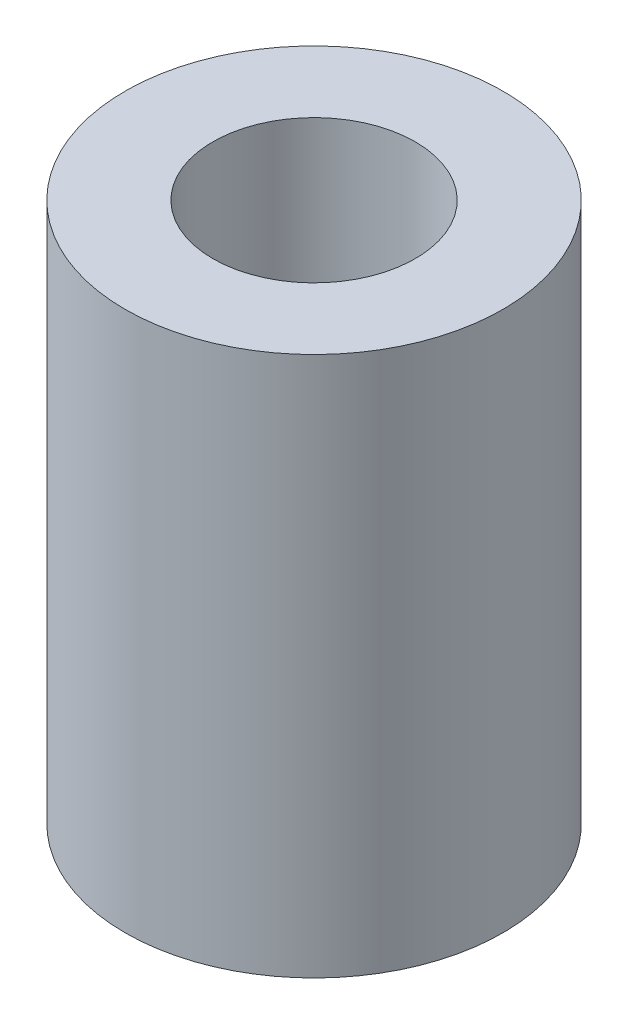
ISO-10303-21;
HEADER;
FILE_DESCRIPTION(('STEP AP214'),'2;1');
FILE_NAME('part.step','',(''),(''),'','','');
FILE_SCHEMA(('AUTOMOTIVE_DESIGN { 1 0 10303 214 1 1 1 1 }'));
ENDSEC;
DATA;
#1=APPLICATION_CONTEXT('core data for automotive mechanical design processes');
#2=APPLICATION_PROTOCOL_DEFINITION('international standard','automotive_design',2000,#1);
#3=PRODUCT_CONTEXT('',#1,'mechanical');
#4=PRODUCT('Part','Part','',(#3));
#5=PRODUCT_RELATED_PRODUCT_CATEGORY('part','',(#4));
#6=PRODUCT_DEFINITION_FORMATION('','',#4);
#7=PRODUCT_DEFINITION_CONTEXT('part definition',#1,'design');
#8=PRODUCT_DEFINITION('design','',#6,#7);
#9=PRODUCT_DEFINITION_SHAPE('','',#8);
#10=(LENGTH_UNIT() NAMED_UNIT(*) SI_UNIT(.MILLI.,.METRE.));
#11=(NAMED_UNIT(*) PLANE_ANGLE_UNIT() SI_UNIT($,.RADIAN.));
#12=(NAMED_UNIT(*) SI_UNIT($,.STERADIAN.) SOLID_ANGLE_UNIT());
#13=UNCERTAINTY_MEASURE_WITH_UNIT(LENGTH_MEASURE(1.E-05),#10,'distance_accuracy_value','');
#14=(GEOMETRIC_REPRESENTATION_CONTEXT(3) GLOBAL_UNCERTAINTY_ASSIGNED_CONTEXT((#13)) GLOBAL_UNIT_ASSIGNED_CONTEXT((#10,
#11,#12)) REPRESENTATION_CONTEXT('',''));
#15=CARTESIAN_POINT('',(0.,0.,0.));
#16=DIRECTION('',(0.,0.,1.));
#17=DIRECTION('',(1.,0.,0.));
#18=AXIS2_PLACEMENT_3D('',#15,#16,#17);
#19=CARTESIAN_POINT('',(0.,10.,0.));
#20=DIRECTION('',(0.,1.,0.));
#21=DIRECTION('',(0.,0.,1.));
#22=AXIS2_PLACEMENT_3D('',#19,#20,#21);
#23=PLANE('',#22);
#24=CARTESIAN_POINT('',(0.,10.,0.));
#25=DIRECTION('',(0.,1.,0.));
#26=DIRECTION('',(0.,0.,1.));
#27=AXIS2_PLACEMENT_3D('',#24,#25,#26);
#28=CIRCLE('',#27,3.5);
#29=CARTESIAN_POINT('',(0.,10.,3.5));
#30=VERTEX_POINT('',#29);
#31=EDGE_CURVE('E10',#30,#30,#28,.T.);
#32=ORIENTED_EDGE('',*,*,#31,.T.);
#33=EDGE_LOOP('',(#32));
#34=FACE_BOUND('',#33,.T.);
#35=CARTESIAN_POINT('',(0.,10.,0.));
#36=DIRECTION('',(0.,1.,0.));
#37=DIRECTION('',(0.,0.,1.));
#38=AXIS2_PLACEMENT_3D('',#35,#36,#37);
#39=CIRCLE('',#38,1.875);
#40=CARTESIAN_POINT('',(0.,10.,1.875));
#41=VERTEX_POINT('',#40);
#42=EDGE_CURVE('E44',#41,#41,#39,.T.);
#43=ORIENTED_EDGE('',*,*,#42,.F.);
#44=EDGE_LOOP('',(#43));
#45=FACE_BOUND('',#44,.T.);
#46=ADVANCED_FACE('F33',(#34,#45),#23,.T.);
#47=CARTESIAN_POINT('',(0.,0.,0.));
#48=DIRECTION('',(0.,1.,0.));
#49=DIRECTION('',(0.,0.,1.));
#50=AXIS2_PLACEMENT_3D('',#47,#48,#49);
#51=PLANE('',#50);
#52=CARTESIAN_POINT('',(0.,0.,0.));
#53=DIRECTION('',(0.,1.,0.));
#54=DIRECTION('',(0.,0.,1.));
#55=AXIS2_PLACEMENT_3D('',#52,#53,#54);
#56=CIRCLE('',#55,3.5);
#57=CARTESIAN_POINT('',(0.,0.,3.5));
#58=VERTEX_POINT('',#57);
#59=EDGE_CURVE('E37',#58,#58,#56,.T.);
#60=ORIENTED_EDGE('',*,*,#59,.F.);
#61=EDGE_LOOP('',(#60));
#62=FACE_BOUND('',#61,.T.);
#63=CARTESIAN_POINT('',(0.,0.,0.));
#64=DIRECTION('',(0.,1.,0.));
#65=DIRECTION('',(0.,0.,1.));
#66=AXIS2_PLACEMENT_3D('',#63,#64,#65);
#67=CIRCLE('',#66,1.875);
#68=CARTESIAN_POINT('',(0.,0.,1.875));
#69=VERTEX_POINT('',#68);
#70=EDGE_CURVE('E46',#69,#69,#67,.T.);
#71=ORIENTED_EDGE('',*,*,#70,.T.);
#72=EDGE_LOOP('',(#71));
#73=FACE_BOUND('',#72,.T.);
#74=ADVANCED_FACE('F56',(#62,#73),#51,.F.);
#75=CARTESIAN_POINT('',(0.,10.,0.));
#76=DIRECTION('',(0.,-1.,0.));
#77=DIRECTION('',(0.,0.,-1.));
#78=AXIS2_PLACEMENT_3D('',#75,#76,#77);
#79=CYLINDRICAL_SURFACE('',#78,3.5);
#80=ORIENTED_EDGE('',*,*,#31,.F.);
#81=EDGE_LOOP('',(#80));
#82=FACE_BOUND('',#81,.T.);
#83=ORIENTED_EDGE('',*,*,#59,.T.);
#84=EDGE_LOOP('',(#83));
#85=FACE_BOUND('',#84,.T.);
#86=ADVANCED_FACE('F35',(#82,#85),#79,.T.);
#87=CARTESIAN_POINT('',(0.,10.,0.));
#88=DIRECTION('',(0.,-1.,0.));
#89=DIRECTION('',(0.,0.,-1.));
#90=AXIS2_PLACEMENT_3D('',#87,#88,#89);
#91=CYLINDRICAL_SURFACE('',#90,1.875);
#92=ORIENTED_EDGE('',*,*,#42,.T.);
#93=EDGE_LOOP('',(#92));
#94=FACE_BOUND('',#93,.T.);
#95=ORIENTED_EDGE('',*,*,#70,.F.);
#96=EDGE_LOOP('',(#95));
#97=FACE_BOUND('',#96,.T.);
#98=ADVANCED_FACE('F52',(#94,#97),#91,.F.);
#99=CLOSED_SHELL('',(#46,#74,#86,#98));
#100=MANIFOLD_SOLID_BREP('B2',#99);
#101=ADVANCED_BREP_SHAPE_REPRESENTATION('',(#18,#100),#14);
#102=SHAPE_DEFINITION_REPRESENTATION(#9,#101);
ENDSEC;
END-ISO-10303-21;
